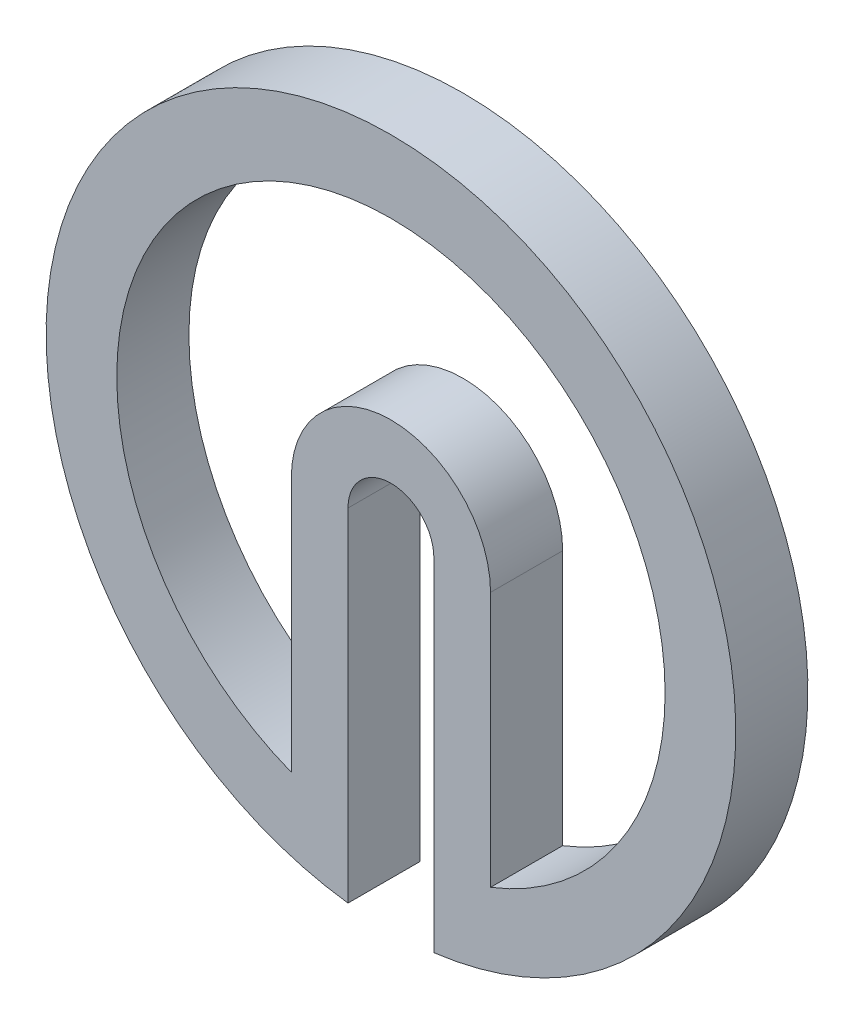
ISO-10303-21;
HEADER;
FILE_DESCRIPTION(('STEP AP214'),'2;1');
FILE_NAME('part.step','',(''),(''),'','','');
FILE_SCHEMA(('AUTOMOTIVE_DESIGN { 1 0 10303 214 1 1 1 1 }'));
ENDSEC;
DATA;
#1=APPLICATION_CONTEXT('core data for automotive mechanical design processes');
#2=APPLICATION_PROTOCOL_DEFINITION('international standard','automotive_design',2000,#1);
#3=PRODUCT_CONTEXT('',#1,'mechanical');
#4=PRODUCT('Part','Part','',(#3));
#5=PRODUCT_RELATED_PRODUCT_CATEGORY('part','',(#4));
#6=PRODUCT_DEFINITION_FORMATION('','',#4);
#7=PRODUCT_DEFINITION_CONTEXT('part definition',#1,'design');
#8=PRODUCT_DEFINITION('design','',#6,#7);
#9=PRODUCT_DEFINITION_SHAPE('','',#8);
#10=(LENGTH_UNIT() NAMED_UNIT(*) SI_UNIT(.MILLI.,.METRE.));
#11=(NAMED_UNIT(*) PLANE_ANGLE_UNIT() SI_UNIT($,.RADIAN.));
#12=(NAMED_UNIT(*) SI_UNIT($,.STERADIAN.) SOLID_ANGLE_UNIT());
#13=UNCERTAINTY_MEASURE_WITH_UNIT(LENGTH_MEASURE(1.E-05),#10,'distance_accuracy_value','');
#14=(GEOMETRIC_REPRESENTATION_CONTEXT(3) GLOBAL_UNCERTAINTY_ASSIGNED_CONTEXT((#13)) GLOBAL_UNIT_ASSIGNED_CONTEXT((#10,
#11,#12)) REPRESENTATION_CONTEXT('',''));
#15=CARTESIAN_POINT('',(0.,0.,0.));
#16=DIRECTION('',(0.,0.,1.));
#17=DIRECTION('',(1.,0.,0.));
#18=AXIS2_PLACEMENT_3D('',#15,#16,#17);
#19=CARTESIAN_POINT('',(0.,0.,-5.334));
#20=DIRECTION('',(0.,0.,1.));
#21=DIRECTION('',(1.,0.,0.));
#22=AXIS2_PLACEMENT_3D('',#19,#20,#21);
#23=CYLINDRICAL_SURFACE('',#22,3.175);
#24=CARTESIAN_POINT('',(0.,0.,0.));
#25=DIRECTION('',(0.,0.,-1.));
#26=DIRECTION('',(1.,0.,0.));
#27=AXIS2_PLACEMENT_3D('',#24,#25,#26);
#28=CIRCLE('',#27,3.175);
#29=CARTESIAN_POINT('',(-3.175,0.,0.));
#30=VERTEX_POINT('',#29);
#31=CARTESIAN_POINT('',(3.175,0.,0.));
#32=VERTEX_POINT('',#31);
#33=EDGE_CURVE('E131',#30,#32,#28,.T.);
#34=ORIENTED_EDGE('',*,*,#33,.F.);
#35=DIRECTION('',(0.,0.,1.));
#36=VECTOR('',#35,1.);
#37=CARTESIAN_POINT('',(-3.175,0.,-5.334));
#38=LINE('',#37,#36);
#39=CARTESIAN_POINT('',(-3.175,0.,-5.334));
#40=VERTEX_POINT('',#39);
#41=EDGE_CURVE('E11',#40,#30,#38,.T.);
#42=ORIENTED_EDGE('',*,*,#41,.F.);
#43=CARTESIAN_POINT('',(0.,0.,-5.334));
#44=DIRECTION('',(0.,0.,-1.));
#45=DIRECTION('',(1.,0.,0.));
#46=AXIS2_PLACEMENT_3D('',#43,#44,#45);
#47=CIRCLE('',#46,3.175);
#48=CARTESIAN_POINT('',(3.175,0.,-5.334));
#49=VERTEX_POINT('',#48);
#50=EDGE_CURVE('E135',#40,#49,#47,.T.);
#51=ORIENTED_EDGE('',*,*,#50,.T.);
#52=DIRECTION('',(0.,0.,1.));
#53=VECTOR('',#52,1.);
#54=CARTESIAN_POINT('',(3.175,0.,-5.334));
#55=LINE('',#54,#53);
#56=EDGE_CURVE('E36',#49,#32,#55,.T.);
#57=ORIENTED_EDGE('',*,*,#56,.T.);
#58=EDGE_LOOP('',(#34,#42,#51,#57));
#59=FACE_BOUND('',#58,.T.);
#60=ADVANCED_FACE('F33',(#59),#23,.F.);
#61=CARTESIAN_POINT('',(-3.175,0.,-5.334));
#62=DIRECTION('',(1.,0.,0.));
#63=DIRECTION('',(0.,0.,-1.));
#64=AXIS2_PLACEMENT_3D('',#61,#62,#63);
#65=PLANE('',#64);
#66=DIRECTION('',(0.,1.,0.));
#67=VECTOR('',#66,1.);
#68=CARTESIAN_POINT('',(-3.175,0.,0.));
#69=LINE('',#68,#67);
#70=CARTESIAN_POINT('',(-3.175,-25.301568627261,0.));
#71=VERTEX_POINT('',#70);
#72=EDGE_CURVE('E139',#71,#30,#69,.T.);
#73=ORIENTED_EDGE('',*,*,#72,.F.);
#74=DIRECTION('',(0.,0.,1.));
#75=VECTOR('',#74,1.);
#76=CARTESIAN_POINT('',(-3.175,-25.301568627261,-5.334));
#77=LINE('',#76,#75);
#78=CARTESIAN_POINT('',(-3.175,-25.301568627261,-5.334));
#79=VERTEX_POINT('',#78);
#80=EDGE_CURVE('E41',#79,#71,#77,.T.);
#81=ORIENTED_EDGE('',*,*,#80,.F.);
#82=DIRECTION('',(0.,1.,0.));
#83=VECTOR('',#82,1.);
#84=CARTESIAN_POINT('',(-3.175,0.,-5.334));
#85=LINE('',#84,#83);
#86=EDGE_CURVE('E145',#79,#40,#85,.T.);
#87=ORIENTED_EDGE('',*,*,#86,.T.);
#88=ORIENTED_EDGE('',*,*,#41,.T.);
#89=EDGE_LOOP('',(#73,#81,#87,#88));
#90=FACE_BOUND('',#89,.T.);
#91=ADVANCED_FACE('F171',(#90),#65,.T.);
#92=CARTESIAN_POINT('',(0.,0.,-5.334));
#93=DIRECTION('',(0.,0.,1.));
#94=DIRECTION('',(1.,0.,0.));
#95=AXIS2_PLACEMENT_3D('',#92,#93,#94);
#96=CYLINDRICAL_SURFACE('',#95,25.5);
#97=CARTESIAN_POINT('',(0.,0.,0.));
#98=DIRECTION('',(0.,0.,1.));
#99=DIRECTION('',(1.,0.,0.));
#100=AXIS2_PLACEMENT_3D('',#97,#98,#99);
#101=CIRCLE('',#100,25.5);
#102=CARTESIAN_POINT('',(3.175,-25.301568627261,0.));
#103=VERTEX_POINT('',#102);
#104=EDGE_CURVE('E153',#103,#71,#101,.T.);
#105=ORIENTED_EDGE('',*,*,#104,.F.);
#106=DIRECTION('',(0.,0.,1.));
#107=VECTOR('',#106,1.);
#108=CARTESIAN_POINT('',(3.175,-25.301568627261,-5.334));
#109=LINE('',#108,#107);
#110=CARTESIAN_POINT('',(3.175,-25.301568627261,-5.334));
#111=VERTEX_POINT('',#110);
#112=EDGE_CURVE('E158',#111,#103,#109,.T.);
#113=ORIENTED_EDGE('',*,*,#112,.F.);
#114=CARTESIAN_POINT('',(0.,0.,-5.334));
#115=DIRECTION('',(0.,0.,1.));
#116=DIRECTION('',(1.,0.,0.));
#117=AXIS2_PLACEMENT_3D('',#114,#115,#116);
#118=CIRCLE('',#117,25.5);
#119=EDGE_CURVE('E142',#111,#79,#118,.T.);
#120=ORIENTED_EDGE('',*,*,#119,.T.);
#121=ORIENTED_EDGE('',*,*,#80,.T.);
#122=EDGE_LOOP('',(#105,#113,#120,#121));
#123=FACE_BOUND('',#122,.T.);
#124=ADVANCED_FACE('F175',(#123),#96,.T.);
#125=CARTESIAN_POINT('',(3.175,0.,-5.334));
#126=DIRECTION('',(-1.,0.,0.));
#127=DIRECTION('',(0.,0.,1.));
#128=AXIS2_PLACEMENT_3D('',#125,#126,#127);
#129=PLANE('',#128);
#130=DIRECTION('',(0.,-1.,0.));
#131=VECTOR('',#130,1.);
#132=CARTESIAN_POINT('',(3.175,0.,0.));
#133=LINE('',#132,#131);
#134=EDGE_CURVE('E150',#32,#103,#133,.T.);
#135=ORIENTED_EDGE('',*,*,#134,.F.);
#136=ORIENTED_EDGE('',*,*,#56,.F.);
#137=DIRECTION('',(0.,-1.,0.));
#138=VECTOR('',#137,1.);
#139=CARTESIAN_POINT('',(3.175,0.,-5.334));
#140=LINE('',#139,#138);
#141=EDGE_CURVE('E138',#49,#111,#140,.T.);
#142=ORIENTED_EDGE('',*,*,#141,.T.);
#143=ORIENTED_EDGE('',*,*,#112,.T.);
#144=EDGE_LOOP('',(#135,#136,#142,#143));
#145=FACE_BOUND('',#144,.T.);
#146=ADVANCED_FACE('F166',(#145),#129,.T.);
#147=CARTESIAN_POINT('',(0.,0.,-5.334));
#148=DIRECTION('',(0.,0.,1.));
#149=DIRECTION('',(1.,0.,0.));
#150=AXIS2_PLACEMENT_3D('',#147,#148,#149);
#151=PLANE('',#150);
#152=DIRECTION('',(0.,1.,0.));
#153=VECTOR('',#152,1.);
#154=CARTESIAN_POINT('',(-7.36581073468621,-0.130956724670451,-5.334));
#155=LINE('',#154,#153);
#156=CARTESIAN_POINT('',(-7.36581073468621,-19.0197537786822,-5.334));
#157=VERTEX_POINT('',#156);
#158=CARTESIAN_POINT('',(-7.36581073468621,-0.130956724670451,-5.334));
#159=VERTEX_POINT('',#158);
#160=EDGE_CURVE('E106',#157,#159,#155,.T.);
#161=ORIENTED_EDGE('',*,*,#160,.T.);
#162=CARTESIAN_POINT('',(0.,-0.13095672467045,-5.334));
#163=DIRECTION('',(0.,0.,-1.));
#164=DIRECTION('',(1.,0.,0.));
#165=AXIS2_PLACEMENT_3D('',#162,#163,#164);
#166=CIRCLE('',#165,7.36581073468621);
#167=CARTESIAN_POINT('',(7.36581073468621,-0.13095672467045,-5.334));
#168=VERTEX_POINT('',#167);
#169=EDGE_CURVE('E100',#159,#168,#166,.T.);
#170=ORIENTED_EDGE('',*,*,#169,.T.);
#171=DIRECTION('',(0.,-1.,0.));
#172=VECTOR('',#171,1.);
#173=CARTESIAN_POINT('',(7.36581073468621,-0.13095672467045,-5.334));
#174=LINE('',#173,#172);
#175=CARTESIAN_POINT('',(7.36581073468621,-19.0197537786822,-5.334));
#176=VERTEX_POINT('',#175);
#177=EDGE_CURVE('E109',#168,#176,#174,.T.);
#178=ORIENTED_EDGE('',*,*,#177,.T.);
#179=CARTESIAN_POINT('',(0.,-0.13095672467045,-5.334));
#180=DIRECTION('',(0.,0.,1.));
#181=DIRECTION('',(1.,0.,0.));
#182=AXIS2_PLACEMENT_3D('',#179,#180,#181);
#183=CIRCLE('',#182,20.2741663682348);
#184=EDGE_CURVE('E49',#176,#157,#183,.T.);
#185=ORIENTED_EDGE('',*,*,#184,.T.);
#186=EDGE_LOOP('',(#161,#170,#178,#185));
#187=FACE_BOUND('',#186,.T.);
#188=ORIENTED_EDGE('',*,*,#50,.F.);
#189=ORIENTED_EDGE('',*,*,#86,.F.);
#190=ORIENTED_EDGE('',*,*,#119,.F.);
#191=ORIENTED_EDGE('',*,*,#141,.F.);
#192=EDGE_LOOP('',(#188,#189,#190,#191));
#193=FACE_BOUND('',#192,.T.);
#194=ADVANCED_FACE('F113',(#187,#193),#151,.F.);
#195=CARTESIAN_POINT('',(0.,0.,0.));
#196=DIRECTION('',(0.,0.,1.));
#197=DIRECTION('',(1.,0.,0.));
#198=AXIS2_PLACEMENT_3D('',#195,#196,#197);
#199=PLANE('',#198);
#200=CARTESIAN_POINT('',(0.,-0.13095672467045,0.));
#201=DIRECTION('',(0.,0.,-1.));
#202=DIRECTION('',(1.,0.,0.));
#203=AXIS2_PLACEMENT_3D('',#200,#201,#202);
#204=CIRCLE('',#203,7.36581073468621);
#205=CARTESIAN_POINT('',(-7.36581073468621,-0.130956724670451,0.));
#206=VERTEX_POINT('',#205);
#207=CARTESIAN_POINT('',(7.36581073468621,-0.13095672467045,0.));
#208=VERTEX_POINT('',#207);
#209=EDGE_CURVE('E57',#206,#208,#204,.T.);
#210=ORIENTED_EDGE('',*,*,#209,.F.);
#211=DIRECTION('',(0.,1.,0.));
#212=VECTOR('',#211,1.);
#213=CARTESIAN_POINT('',(-7.36581073468621,-0.130956724670451,0.));
#214=LINE('',#213,#212);
#215=CARTESIAN_POINT('',(-7.36581073468621,-19.0197537786822,0.));
#216=VERTEX_POINT('',#215);
#217=EDGE_CURVE('E116',#216,#206,#214,.T.);
#218=ORIENTED_EDGE('',*,*,#217,.F.);
#219=CARTESIAN_POINT('',(0.,-0.13095672467045,0.));
#220=DIRECTION('',(0.,0.,1.));
#221=DIRECTION('',(1.,0.,0.));
#222=AXIS2_PLACEMENT_3D('',#219,#220,#221);
#223=CIRCLE('',#222,20.2741663682348);
#224=CARTESIAN_POINT('',(7.3658107346862,-19.0197537786822,0.));
#225=VERTEX_POINT('',#224);
#226=EDGE_CURVE('E119',#225,#216,#223,.T.);
#227=ORIENTED_EDGE('',*,*,#226,.F.);
#228=DIRECTION('',(0.,-1.,0.));
#229=VECTOR('',#228,1.);
#230=CARTESIAN_POINT('',(7.36581073468621,-0.13095672467045,0.));
#231=LINE('',#230,#229);
#232=EDGE_CURVE('E125',#208,#225,#231,.T.);
#233=ORIENTED_EDGE('',*,*,#232,.F.);
#234=EDGE_LOOP('',(#210,#218,#227,#233));
#235=FACE_BOUND('',#234,.T.);
#236=ORIENTED_EDGE('',*,*,#33,.T.);
#237=ORIENTED_EDGE('',*,*,#134,.T.);
#238=ORIENTED_EDGE('',*,*,#104,.T.);
#239=ORIENTED_EDGE('',*,*,#72,.T.);
#240=EDGE_LOOP('',(#236,#237,#238,#239));
#241=FACE_BOUND('',#240,.T.);
#242=ADVANCED_FACE('F168',(#235,#241),#199,.T.);
#243=CARTESIAN_POINT('',(0.,-0.13095672467045,-5.334));
#244=DIRECTION('',(0.,0.,1.));
#245=DIRECTION('',(1.,0.,0.));
#246=AXIS2_PLACEMENT_3D('',#243,#244,#245);
#247=CYLINDRICAL_SURFACE('',#246,7.36581073468621);
#248=ORIENTED_EDGE('',*,*,#209,.T.);
#249=DIRECTION('',(0.,0.,1.));
#250=VECTOR('',#249,1.);
#251=CARTESIAN_POINT('',(7.36581073468621,-0.13095672467045,-5.334));
#252=LINE('',#251,#250);
#253=EDGE_CURVE('E96',#168,#208,#252,.T.);
#254=ORIENTED_EDGE('',*,*,#253,.F.);
#255=ORIENTED_EDGE('',*,*,#169,.F.);
#256=DIRECTION('',(0.,0.,1.));
#257=VECTOR('',#256,1.);
#258=CARTESIAN_POINT('',(-7.36581073468621,-0.130956724670451,-5.334));
#259=LINE('',#258,#257);
#260=EDGE_CURVE('E129',#159,#206,#259,.T.);
#261=ORIENTED_EDGE('',*,*,#260,.T.);
#262=EDGE_LOOP('',(#248,#254,#255,#261));
#263=FACE_BOUND('',#262,.T.);
#264=ADVANCED_FACE('F98',(#263),#247,.T.);
#265=CARTESIAN_POINT('',(-7.36581073468621,-0.130956724670451,-5.334));
#266=DIRECTION('',(1.,0.,0.));
#267=DIRECTION('',(0.,1.,0.));
#268=AXIS2_PLACEMENT_3D('',#265,#266,#267);
#269=PLANE('',#268);
#270=ORIENTED_EDGE('',*,*,#217,.T.);
#271=ORIENTED_EDGE('',*,*,#260,.F.);
#272=ORIENTED_EDGE('',*,*,#160,.F.);
#273=DIRECTION('',(0.,0.,1.));
#274=VECTOR('',#273,1.);
#275=CARTESIAN_POINT('',(-7.36581073468621,-19.0197537786822,-5.334));
#276=LINE('',#275,#274);
#277=EDGE_CURVE('E132',#157,#216,#276,.T.);
#278=ORIENTED_EDGE('',*,*,#277,.T.);
#279=EDGE_LOOP('',(#270,#271,#272,#278));
#280=FACE_BOUND('',#279,.T.);
#281=ADVANCED_FACE('F226',(#280),#269,.F.);
#282=CARTESIAN_POINT('',(0.,-0.13095672467045,-5.334));
#283=DIRECTION('',(0.,0.,1.));
#284=DIRECTION('',(1.,0.,0.));
#285=AXIS2_PLACEMENT_3D('',#282,#283,#284);
#286=CYLINDRICAL_SURFACE('',#285,20.2741663682348);
#287=ORIENTED_EDGE('',*,*,#226,.T.);
#288=ORIENTED_EDGE('',*,*,#277,.F.);
#289=ORIENTED_EDGE('',*,*,#184,.F.);
#290=DIRECTION('',(0.,0.,1.));
#291=VECTOR('',#290,1.);
#292=CARTESIAN_POINT('',(7.3658107346862,-19.0197537786822,-5.334));
#293=LINE('',#292,#291);
#294=EDGE_CURVE('E105',#176,#225,#293,.T.);
#295=ORIENTED_EDGE('',*,*,#294,.T.);
#296=EDGE_LOOP('',(#287,#288,#289,#295));
#297=FACE_BOUND('',#296,.T.);
#298=ADVANCED_FACE('F235',(#297),#286,.F.);
#299=CARTESIAN_POINT('',(7.36581073468621,-0.13095672467045,-5.334));
#300=DIRECTION('',(-1.,0.,0.));
#301=DIRECTION('',(0.,0.,1.));
#302=AXIS2_PLACEMENT_3D('',#299,#300,#301);
#303=PLANE('',#302);
#304=ORIENTED_EDGE('',*,*,#232,.T.);
#305=ORIENTED_EDGE('',*,*,#294,.F.);
#306=ORIENTED_EDGE('',*,*,#177,.F.);
#307=ORIENTED_EDGE('',*,*,#253,.T.);
#308=EDGE_LOOP('',(#304,#305,#306,#307));
#309=FACE_BOUND('',#308,.T.);
#310=ADVANCED_FACE('F110',(#309),#303,.F.);
#311=CLOSED_SHELL('',(#60,#91,#124,#146,#194,#242,#264,#281,#298,#310));
#312=MANIFOLD_SOLID_BREP('B2',#311);
#313=ADVANCED_BREP_SHAPE_REPRESENTATION('',(#18,#312),#14);
#314=SHAPE_DEFINITION_REPRESENTATION(#9,#313);
ENDSEC;
END-ISO-10303-21;
